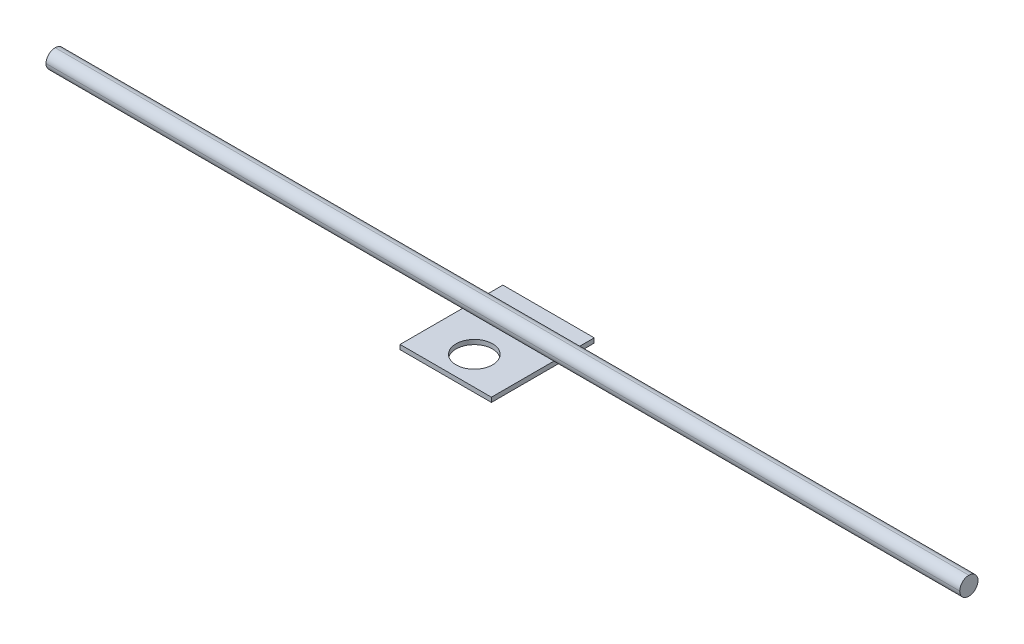
ISO-10303-21;
HEADER;
FILE_DESCRIPTION(('STEP AP214'),'2;1');
FILE_NAME('part.step','',(''),(''),'','','');
FILE_SCHEMA(('AUTOMOTIVE_DESIGN { 1 0 10303 214 1 1 1 1 }'));
ENDSEC;
DATA;
#1=APPLICATION_CONTEXT('core data for automotive mechanical design processes');
#2=APPLICATION_PROTOCOL_DEFINITION('international standard','automotive_design',2000,#1);
#3=PRODUCT_CONTEXT('',#1,'mechanical');
#4=PRODUCT('Part','Part','',(#3));
#5=PRODUCT_RELATED_PRODUCT_CATEGORY('part','',(#4));
#6=PRODUCT_DEFINITION_FORMATION('','',#4);
#7=PRODUCT_DEFINITION_CONTEXT('part definition',#1,'design');
#8=PRODUCT_DEFINITION('design','',#6,#7);
#9=PRODUCT_DEFINITION_SHAPE('','',#8);
#10=(LENGTH_UNIT() NAMED_UNIT(*) SI_UNIT(.MILLI.,.METRE.));
#11=(NAMED_UNIT(*) PLANE_ANGLE_UNIT() SI_UNIT($,.RADIAN.));
#12=(NAMED_UNIT(*) SI_UNIT($,.STERADIAN.) SOLID_ANGLE_UNIT());
#13=UNCERTAINTY_MEASURE_WITH_UNIT(LENGTH_MEASURE(1.E-05),#10,'distance_accuracy_value','');
#14=(GEOMETRIC_REPRESENTATION_CONTEXT(3) GLOBAL_UNCERTAINTY_ASSIGNED_CONTEXT((#13)) GLOBAL_UNIT_ASSIGNED_CONTEXT((#10,
#11,#12)) REPRESENTATION_CONTEXT('',''));
#15=CARTESIAN_POINT('',(0.,0.,0.));
#16=DIRECTION('',(0.,0.,1.));
#17=DIRECTION('',(1.,0.,0.));
#18=AXIS2_PLACEMENT_3D('',#15,#16,#17);
#19=CARTESIAN_POINT('',(-200.,10.,0.));
#20=DIRECTION('',(-1.,0.,0.));
#21=DIRECTION('',(0.,0.,1.));
#22=AXIS2_PLACEMENT_3D('',#19,#20,#21);
#23=PLANE('',#22);
#24=CARTESIAN_POINT('',(-200.,6.,-6.50000000000002));
#25=DIRECTION('',(-1.,0.,0.));
#26=DIRECTION('',(0.,0.,1.));
#27=AXIS2_PLACEMENT_3D('',#24,#25,#26);
#28=CIRCLE('',#27,4.);
#29=CARTESIAN_POINT('',(-200.,10.,-6.50000000000002));
#30=VERTEX_POINT('',#29);
#31=CARTESIAN_POINT('',(-200.,6.,-10.5));
#32=VERTEX_POINT('',#31);
#33=EDGE_CURVE('E68',#30,#32,#28,.T.);
#34=ORIENTED_EDGE('',*,*,#33,.T.);
#35=CARTESIAN_POINT('',(-200.,6.,-6.50000000000002));
#36=DIRECTION('',(-1.,0.,0.));
#37=DIRECTION('',(0.,0.,1.));
#38=AXIS2_PLACEMENT_3D('',#35,#36,#37);
#39=CIRCLE('',#38,4.);
#40=CARTESIAN_POINT('',(-200.,2.,-6.50000000000002));
#41=VERTEX_POINT('',#40);
#42=EDGE_CURVE('E12',#32,#41,#39,.T.);
#43=ORIENTED_EDGE('',*,*,#42,.T.);
#44=CARTESIAN_POINT('',(-200.,6.,-6.50000000000002));
#45=DIRECTION('',(-1.,0.,0.));
#46=DIRECTION('',(0.,0.,1.));
#47=AXIS2_PLACEMENT_3D('',#44,#45,#46);
#48=CIRCLE('',#47,4.);
#49=CARTESIAN_POINT('',(-200.,6.,-2.50000000000002));
#50=VERTEX_POINT('',#49);
#51=EDGE_CURVE('E61',#41,#50,#48,.T.);
#52=ORIENTED_EDGE('',*,*,#51,.T.);
#53=CARTESIAN_POINT('',(-200.,6.,-6.50000000000002));
#54=DIRECTION('',(-1.,0.,0.));
#55=DIRECTION('',(0.,0.,1.));
#56=AXIS2_PLACEMENT_3D('',#53,#54,#55);
#57=CIRCLE('',#56,4.);
#58=EDGE_CURVE('E73',#50,#30,#57,.T.);
#59=ORIENTED_EDGE('',*,*,#58,.T.);
#60=EDGE_LOOP('',(#34,#43,#52,#59));
#61=FACE_BOUND('',#60,.T.);
#62=ADVANCED_FACE('F51',(#61),#23,.T.);
#63=CARTESIAN_POINT('',(200.,10.,0.));
#64=DIRECTION('',(-1.,0.,0.));
#65=DIRECTION('',(0.,0.,1.));
#66=AXIS2_PLACEMENT_3D('',#63,#64,#65);
#67=PLANE('',#66);
#68=CARTESIAN_POINT('',(200.,6.,-6.50000000000009));
#69=DIRECTION('',(-1.,0.,0.));
#70=DIRECTION('',(0.,0.,1.));
#71=AXIS2_PLACEMENT_3D('',#68,#69,#70);
#72=CIRCLE('',#71,4.);
#73=CARTESIAN_POINT('',(200.,6.,-2.50000000000009));
#74=VERTEX_POINT('',#73);
#75=CARTESIAN_POINT('',(200.,2.,-6.50000000000009));
#76=VERTEX_POINT('',#75);
#77=EDGE_CURVE('E94',#74,#76,#72,.F.);
#78=ORIENTED_EDGE('',*,*,#77,.T.);
#79=CARTESIAN_POINT('',(200.,6.,-6.50000000000009));
#80=DIRECTION('',(-1.,0.,0.));
#81=DIRECTION('',(0.,0.,1.));
#82=AXIS2_PLACEMENT_3D('',#79,#80,#81);
#83=CIRCLE('',#82,4.);
#84=CARTESIAN_POINT('',(200.,6.,-10.5000000000001));
#85=VERTEX_POINT('',#84);
#86=EDGE_CURVE('E98',#76,#85,#83,.F.);
#87=ORIENTED_EDGE('',*,*,#86,.T.);
#88=CARTESIAN_POINT('',(200.,6.,-6.50000000000009));
#89=DIRECTION('',(-1.,0.,0.));
#90=DIRECTION('',(0.,0.,1.));
#91=AXIS2_PLACEMENT_3D('',#88,#89,#90);
#92=CIRCLE('',#91,4.);
#93=CARTESIAN_POINT('',(200.,10.,-6.50000000000009));
#94=VERTEX_POINT('',#93);
#95=EDGE_CURVE('E131',#85,#94,#92,.F.);
#96=ORIENTED_EDGE('',*,*,#95,.T.);
#97=CARTESIAN_POINT('',(200.,6.,-6.50000000000009));
#98=DIRECTION('',(-1.,0.,0.));
#99=DIRECTION('',(0.,0.,1.));
#100=AXIS2_PLACEMENT_3D('',#97,#98,#99);
#101=CIRCLE('',#100,4.);
#102=EDGE_CURVE('E100',#94,#74,#101,.F.);
#103=ORIENTED_EDGE('',*,*,#102,.T.);
#104=EDGE_LOOP('',(#78,#87,#96,#103));
#105=FACE_BOUND('',#104,.T.);
#106=ADVANCED_FACE('F96',(#105),#67,.F.);
#107=CARTESIAN_POINT('',(0.,6.,-6.50000000000006));
#108=DIRECTION('',(-1.,0.,0.));
#109=DIRECTION('',(0.,0.,1.));
#110=AXIS2_PLACEMENT_3D('',#107,#108,#109);
#111=CYLINDRICAL_SURFACE('',#110,4.);
#112=DIRECTION('',(1.,0.,0.));
#113=VECTOR('',#112,1.);
#114=CARTESIAN_POINT('',(-200.,6.,-2.50000000000002));
#115=LINE('',#114,#113);
#116=EDGE_CURVE('E127',#74,#50,#115,.F.);
#117=ORIENTED_EDGE('',*,*,#116,.F.);
#118=ORIENTED_EDGE('',*,*,#102,.F.);
#119=DIRECTION('',(1.,0.,0.));
#120=VECTOR('',#119,1.);
#121=CARTESIAN_POINT('',(200.,10.,-6.50000000000009));
#122=LINE('',#121,#120);
#123=EDGE_CURVE('E55',#30,#94,#122,.T.);
#124=ORIENTED_EDGE('',*,*,#123,.F.);
#125=ORIENTED_EDGE('',*,*,#58,.F.);
#126=EDGE_LOOP('',(#117,#118,#124,#125));
#127=FACE_BOUND('',#126,.T.);
#128=ADVANCED_FACE('F53',(#127),#111,.T.);
#129=CARTESIAN_POINT('',(0.,6.,-6.50000000000006));
#130=DIRECTION('',(1.,0.,0.));
#131=DIRECTION('',(0.,0.,-1.));
#132=AXIS2_PLACEMENT_3D('',#129,#130,#131);
#133=CYLINDRICAL_SURFACE('',#132,4.);
#134=ORIENTED_EDGE('',*,*,#123,.T.);
#135=ORIENTED_EDGE('',*,*,#95,.F.);
#136=DIRECTION('',(1.,0.,0.));
#137=VECTOR('',#136,1.);
#138=CARTESIAN_POINT('',(0.,6.,-10.5000000000001));
#139=LINE('',#138,#137);
#140=EDGE_CURVE('E112',#32,#85,#139,.T.);
#141=ORIENTED_EDGE('',*,*,#140,.F.);
#142=ORIENTED_EDGE('',*,*,#33,.F.);
#143=EDGE_LOOP('',(#134,#135,#141,#142));
#144=FACE_BOUND('',#143,.T.);
#145=ADVANCED_FACE('F137',(#144),#133,.T.);
#146=CARTESIAN_POINT('',(0.,6.,-6.50000000000006));
#147=DIRECTION('',(1.,0.,0.));
#148=DIRECTION('',(0.,0.,-1.));
#149=AXIS2_PLACEMENT_3D('',#146,#147,#148);
#150=CYLINDRICAL_SURFACE('',#149,4.);
#151=ORIENTED_EDGE('',*,*,#116,.T.);
#152=ORIENTED_EDGE('',*,*,#51,.F.);
#153=DIRECTION('',(1.,0.,0.));
#154=VECTOR('',#153,1.);
#155=CARTESIAN_POINT('',(0.,2.,-6.50000000000006));
#156=LINE('',#155,#154);
#157=EDGE_CURVE('E107',#76,#41,#156,.F.);
#158=ORIENTED_EDGE('',*,*,#157,.F.);
#159=ORIENTED_EDGE('',*,*,#77,.F.);
#160=EDGE_LOOP('',(#151,#152,#158,#159));
#161=FACE_BOUND('',#160,.T.);
#162=ADVANCED_FACE('F108',(#161),#150,.T.);
#163=CARTESIAN_POINT('',(0.,6.,-6.50000000000006));
#164=DIRECTION('',(-1.,0.,0.));
#165=DIRECTION('',(0.,0.,1.));
#166=AXIS2_PLACEMENT_3D('',#163,#164,#165);
#167=CYLINDRICAL_SURFACE('',#166,4.);
#168=ORIENTED_EDGE('',*,*,#42,.F.);
#169=ORIENTED_EDGE('',*,*,#140,.T.);
#170=ORIENTED_EDGE('',*,*,#86,.F.);
#171=ORIENTED_EDGE('',*,*,#157,.T.);
#172=EDGE_LOOP('',(#168,#169,#170,#171));
#173=FACE_BOUND('',#172,.T.);
#174=ADVANCED_FACE('F114',(#173),#167,.T.);
#175=CLOSED_SHELL('',(#62,#106,#128,#145,#162,#174));
#176=MANIFOLD_SOLID_BREP('B2',#175);
#177=CARTESIAN_POINT('',(20.,2.,22.5));
#178=DIRECTION('',(-1.,0.,0.));
#179=DIRECTION('',(0.,0.,1.));
#180=AXIS2_PLACEMENT_3D('',#177,#178,#179);
#181=PLANE('',#180);
#182=DIRECTION('',(0.,0.,-1.));
#183=VECTOR('',#182,1.);
#184=CARTESIAN_POINT('',(20.,0.,22.5));
#185=LINE('',#184,#183);
#186=CARTESIAN_POINT('',(20.,0.,22.5));
#187=VERTEX_POINT('',#186);
#188=CARTESIAN_POINT('',(20.,0.,-22.5));
#189=VERTEX_POINT('',#188);
#190=EDGE_CURVE('E250',#187,#189,#185,.T.);
#191=ORIENTED_EDGE('',*,*,#190,.T.);
#192=DIRECTION('',(0.,-1.,0.));
#193=VECTOR('',#192,1.);
#194=CARTESIAN_POINT('',(20.,2.,-22.5));
#195=LINE('',#194,#193);
#196=CARTESIAN_POINT('',(20.,2.,-22.5));
#197=VERTEX_POINT('',#196);
#198=EDGE_CURVE('E49',#197,#189,#195,.T.);
#199=ORIENTED_EDGE('',*,*,#198,.F.);
#200=DIRECTION('',(0.,0.,-1.));
#201=VECTOR('',#200,1.);
#202=CARTESIAN_POINT('',(20.,2.,22.5));
#203=LINE('',#202,#201);
#204=CARTESIAN_POINT('',(20.,2.,22.5));
#205=VERTEX_POINT('',#204);
#206=EDGE_CURVE('E238',#205,#197,#203,.T.);
#207=ORIENTED_EDGE('',*,*,#206,.F.);
#208=DIRECTION('',(0.,-1.,0.));
#209=VECTOR('',#208,1.);
#210=CARTESIAN_POINT('',(20.,2.,22.5));
#211=LINE('',#210,#209);
#212=EDGE_CURVE('E246',#205,#187,#211,.T.);
#213=ORIENTED_EDGE('',*,*,#212,.T.);
#214=EDGE_LOOP('',(#191,#199,#207,#213));
#215=FACE_BOUND('',#214,.T.);
#216=ADVANCED_FACE('F187',(#215),#181,.F.);
#217=CARTESIAN_POINT('',(-20.,2.,-22.5));
#218=DIRECTION('',(0.,0.,1.));
#219=DIRECTION('',(1.,0.,0.));
#220=AXIS2_PLACEMENT_3D('',#217,#218,#219);
#221=PLANE('',#220);
#222=DIRECTION('',(-1.,0.,0.));
#223=VECTOR('',#222,1.);
#224=CARTESIAN_POINT('',(-20.,0.,-22.5));
#225=LINE('',#224,#223);
#226=CARTESIAN_POINT('',(-20.,0.,-22.5));
#227=VERTEX_POINT('',#226);
#228=EDGE_CURVE('E242',#189,#227,#225,.T.);
#229=ORIENTED_EDGE('',*,*,#228,.T.);
#230=DIRECTION('',(0.,-1.,0.));
#231=VECTOR('',#230,1.);
#232=CARTESIAN_POINT('',(-20.,2.,-22.5));
#233=LINE('',#232,#231);
#234=CARTESIAN_POINT('',(-20.,2.,-22.5));
#235=VERTEX_POINT('',#234);
#236=EDGE_CURVE('E195',#235,#227,#233,.T.);
#237=ORIENTED_EDGE('',*,*,#236,.F.);
#238=DIRECTION('',(-1.,0.,0.));
#239=VECTOR('',#238,1.);
#240=CARTESIAN_POINT('',(-20.,2.,-22.5));
#241=LINE('',#240,#239);
#242=EDGE_CURVE('E233',#197,#235,#241,.T.);
#243=ORIENTED_EDGE('',*,*,#242,.F.);
#244=ORIENTED_EDGE('',*,*,#198,.T.);
#245=EDGE_LOOP('',(#229,#237,#243,#244));
#246=FACE_BOUND('',#245,.T.);
#247=ADVANCED_FACE('F241',(#246),#221,.F.);
#248=CARTESIAN_POINT('',(-20.,2.,22.5));
#249=DIRECTION('',(1.,0.,0.));
#250=DIRECTION('',(0.,0.,-1.));
#251=AXIS2_PLACEMENT_3D('',#248,#249,#250);
#252=PLANE('',#251);
#253=DIRECTION('',(0.,0.,1.));
#254=VECTOR('',#253,1.);
#255=CARTESIAN_POINT('',(-20.,0.,22.5));
#256=LINE('',#255,#254);
#257=CARTESIAN_POINT('',(-20.,0.,22.5));
#258=VERTEX_POINT('',#257);
#259=EDGE_CURVE('E220',#227,#258,#256,.T.);
#260=ORIENTED_EDGE('',*,*,#259,.T.);
#261=DIRECTION('',(0.,-1.,0.));
#262=VECTOR('',#261,1.);
#263=CARTESIAN_POINT('',(-20.,2.,22.5));
#264=LINE('',#263,#262);
#265=CARTESIAN_POINT('',(-20.,2.,22.5));
#266=VERTEX_POINT('',#265);
#267=EDGE_CURVE('E243',#266,#258,#264,.T.);
#268=ORIENTED_EDGE('',*,*,#267,.F.);
#269=DIRECTION('',(0.,0.,1.));
#270=VECTOR('',#269,1.);
#271=CARTESIAN_POINT('',(-20.,2.,22.5));
#272=LINE('',#271,#270);
#273=EDGE_CURVE('E236',#235,#266,#272,.T.);
#274=ORIENTED_EDGE('',*,*,#273,.F.);
#275=ORIENTED_EDGE('',*,*,#236,.T.);
#276=EDGE_LOOP('',(#260,#268,#274,#275));
#277=FACE_BOUND('',#276,.T.);
#278=ADVANCED_FACE('F244',(#277),#252,.F.);
#279=CARTESIAN_POINT('',(-20.,2.,22.5));
#280=DIRECTION('',(0.,0.,-1.));
#281=DIRECTION('',(-1.,0.,0.));
#282=AXIS2_PLACEMENT_3D('',#279,#280,#281);
#283=PLANE('',#282);
#284=DIRECTION('',(1.,0.,0.));
#285=VECTOR('',#284,1.);
#286=CARTESIAN_POINT('',(-20.,0.,22.5));
#287=LINE('',#286,#285);
#288=EDGE_CURVE('E226',#258,#187,#287,.T.);
#289=ORIENTED_EDGE('',*,*,#288,.T.);
#290=ORIENTED_EDGE('',*,*,#212,.F.);
#291=DIRECTION('',(1.,0.,0.));
#292=VECTOR('',#291,1.);
#293=CARTESIAN_POINT('',(-20.,2.,22.5));
#294=LINE('',#293,#292);
#295=EDGE_CURVE('E203',#266,#205,#294,.T.);
#296=ORIENTED_EDGE('',*,*,#295,.F.);
#297=ORIENTED_EDGE('',*,*,#267,.T.);
#298=EDGE_LOOP('',(#289,#290,#296,#297));
#299=FACE_BOUND('',#298,.T.);
#300=ADVANCED_FACE('F258',(#299),#283,.F.);
#301=CARTESIAN_POINT('',(0.,2.,0.));
#302=DIRECTION('',(0.,-1.,0.));
#303=DIRECTION('',(0.,0.,-1.));
#304=AXIS2_PLACEMENT_3D('',#301,#302,#303);
#305=PLANE('',#304);
#306=CARTESIAN_POINT('',(0.,2.,9.99999999999999));
#307=DIRECTION('',(0.,1.,0.));
#308=DIRECTION('',(0.,0.,1.));
#309=AXIS2_PLACEMENT_3D('',#306,#307,#308);
#310=CIRCLE('',#309,8.);
#311=CARTESIAN_POINT('',(0.,2.,18.));
#312=VERTEX_POINT('',#311);
#313=EDGE_CURVE('E264',#312,#312,#310,.T.);
#314=ORIENTED_EDGE('',*,*,#313,.F.);
#315=EDGE_LOOP('',(#314));
#316=FACE_BOUND('',#315,.T.);
#317=ORIENTED_EDGE('',*,*,#206,.T.);
#318=ORIENTED_EDGE('',*,*,#242,.T.);
#319=ORIENTED_EDGE('',*,*,#273,.T.);
#320=ORIENTED_EDGE('',*,*,#295,.T.);
#321=EDGE_LOOP('',(#317,#318,#319,#320));
#322=FACE_BOUND('',#321,.T.);
#323=ADVANCED_FACE('F234',(#316,#322),#305,.F.);
#324=CARTESIAN_POINT('',(0.,0.,0.));
#325=DIRECTION('',(0.,-1.,0.));
#326=DIRECTION('',(0.,0.,-1.));
#327=AXIS2_PLACEMENT_3D('',#324,#325,#326);
#328=PLANE('',#327);
#329=CARTESIAN_POINT('',(0.,0.,9.99999999999999));
#330=DIRECTION('',(0.,1.,0.));
#331=DIRECTION('',(0.,0.,1.));
#332=AXIS2_PLACEMENT_3D('',#329,#330,#331);
#333=CIRCLE('',#332,8.);
#334=CARTESIAN_POINT('',(0.,0.,18.));
#335=VERTEX_POINT('',#334);
#336=EDGE_CURVE('E253',#335,#335,#333,.T.);
#337=ORIENTED_EDGE('',*,*,#336,.T.);
#338=EDGE_LOOP('',(#337));
#339=FACE_BOUND('',#338,.T.);
#340=ORIENTED_EDGE('',*,*,#190,.F.);
#341=ORIENTED_EDGE('',*,*,#288,.F.);
#342=ORIENTED_EDGE('',*,*,#259,.F.);
#343=ORIENTED_EDGE('',*,*,#228,.F.);
#344=EDGE_LOOP('',(#340,#341,#342,#343));
#345=FACE_BOUND('',#344,.T.);
#346=ADVANCED_FACE('F261',(#339,#345),#328,.T.);
#347=CARTESIAN_POINT('',(0.,0.,9.99999999999999));
#348=DIRECTION('',(0.,1.,0.));
#349=DIRECTION('',(0.,0.,1.));
#350=AXIS2_PLACEMENT_3D('',#347,#348,#349);
#351=CYLINDRICAL_SURFACE('',#350,8.);
#352=ORIENTED_EDGE('',*,*,#336,.F.);
#353=EDGE_LOOP('',(#352));
#354=FACE_BOUND('',#353,.T.);
#355=ORIENTED_EDGE('',*,*,#313,.T.);
#356=EDGE_LOOP('',(#355));
#357=FACE_BOUND('',#356,.T.);
#358=ADVANCED_FACE('F271',(#354,#357),#351,.F.);
#359=CLOSED_SHELL('',(#216,#247,#278,#300,#323,#346,#358));
#360=MANIFOLD_SOLID_BREP('B6',#359);
#361=ADVANCED_BREP_SHAPE_REPRESENTATION('',(#18,#176,#360),#14);
#362=SHAPE_DEFINITION_REPRESENTATION(#9,#361);
ENDSEC;
END-ISO-10303-21;
